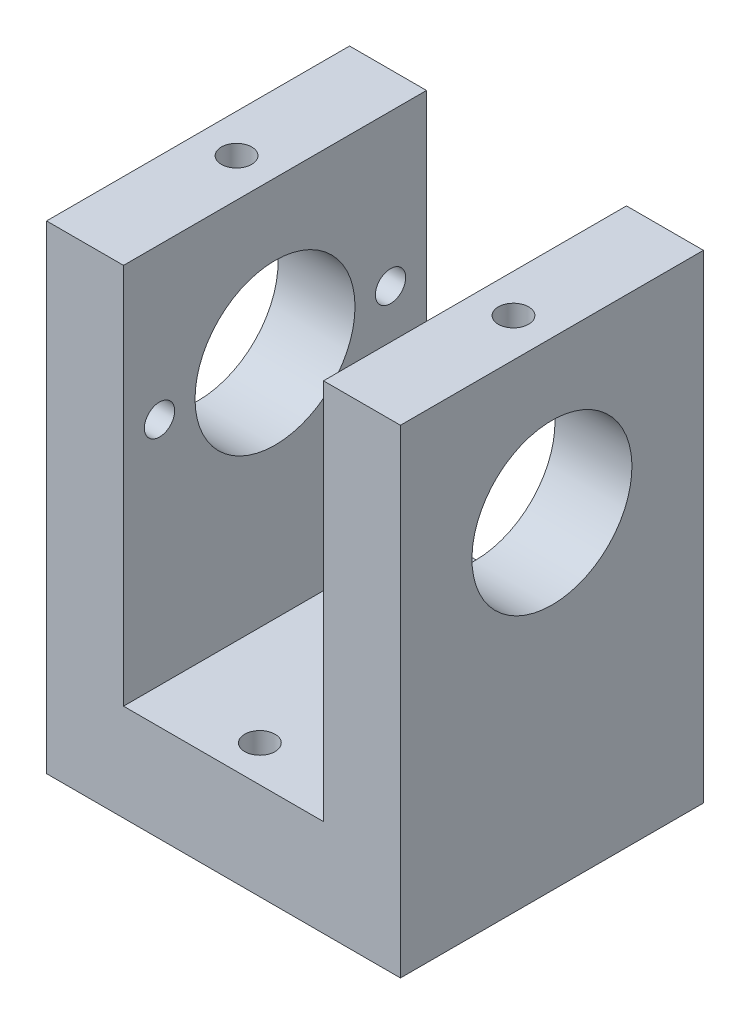
ISO-10303-21;
HEADER;
FILE_DESCRIPTION(('STEP AP214'),'2;1');
FILE_NAME('part.step','',(''),(''),'','','');
FILE_SCHEMA(('AUTOMOTIVE_DESIGN { 1 0 10303 214 1 1 1 1 }'));
ENDSEC;
DATA;
#1=APPLICATION_CONTEXT('core data for automotive mechanical design processes');
#2=APPLICATION_PROTOCOL_DEFINITION('international standard','automotive_design',2000,#1);
#3=PRODUCT_CONTEXT('',#1,'mechanical');
#4=PRODUCT('Part','Part','',(#3));
#5=PRODUCT_RELATED_PRODUCT_CATEGORY('part','',(#4));
#6=PRODUCT_DEFINITION_FORMATION('','',#4);
#7=PRODUCT_DEFINITION_CONTEXT('part definition',#1,'design');
#8=PRODUCT_DEFINITION('design','',#6,#7);
#9=PRODUCT_DEFINITION_SHAPE('','',#8);
#10=(LENGTH_UNIT() NAMED_UNIT(*) SI_UNIT(.MILLI.,.METRE.));
#11=(NAMED_UNIT(*) PLANE_ANGLE_UNIT() SI_UNIT($,.RADIAN.));
#12=(NAMED_UNIT(*) SI_UNIT($,.STERADIAN.) SOLID_ANGLE_UNIT());
#13=UNCERTAINTY_MEASURE_WITH_UNIT(LENGTH_MEASURE(1.E-05),#10,'distance_accuracy_value','');
#14=(GEOMETRIC_REPRESENTATION_CONTEXT(3) GLOBAL_UNCERTAINTY_ASSIGNED_CONTEXT((#13)) GLOBAL_UNIT_ASSIGNED_CONTEXT((#10,
#11,#12)) REPRESENTATION_CONTEXT('',''));
#15=CARTESIAN_POINT('',(0.,0.,0.));
#16=DIRECTION('',(0.,0.,1.));
#17=DIRECTION('',(1.,0.,0.));
#18=AXIS2_PLACEMENT_3D('',#15,#16,#17);
#19=CARTESIAN_POINT('',(-14.6,12.5,-12.5));
#20=DIRECTION('',(0.,1.,0.));
#21=DIRECTION('',(0.,0.,1.));
#22=AXIS2_PLACEMENT_3D('',#19,#20,#21);
#23=PLANE('',#22);
#24=CARTESIAN_POINT('',(-11.425,12.5,0.));
#25=DIRECTION('',(0.,1.,0.));
#26=DIRECTION('',(0.,0.,1.));
#27=AXIS2_PLACEMENT_3D('',#24,#25,#26);
#28=CIRCLE('',#27,1.24999999999999);
#29=CARTESIAN_POINT('',(-11.425,12.5,1.24999999999999));
#30=VERTEX_POINT('',#29);
#31=EDGE_CURVE('E129',#30,#30,#28,.T.);
#32=ORIENTED_EDGE('',*,*,#31,.F.);
#33=EDGE_LOOP('',(#32));
#34=FACE_BOUND('',#33,.T.);
#35=DIRECTION('',(0.,0.,1.));
#36=VECTOR('',#35,1.);
#37=CARTESIAN_POINT('',(-14.6,12.5,-12.5));
#38=LINE('',#37,#36);
#39=CARTESIAN_POINT('',(-14.6,12.5,-12.5));
#40=VERTEX_POINT('',#39);
#41=CARTESIAN_POINT('',(-14.6,12.5,12.5));
#42=VERTEX_POINT('',#41);
#43=EDGE_CURVE('E192',#40,#42,#38,.T.);
#44=ORIENTED_EDGE('',*,*,#43,.T.);
#45=DIRECTION('',(-1.,0.,0.));
#46=VECTOR('',#45,1.);
#47=CARTESIAN_POINT('',(-14.6,12.5,12.5));
#48=LINE('',#47,#46);
#49=CARTESIAN_POINT('',(-8.25,12.5,12.5));
#50=VERTEX_POINT('',#49);
#51=EDGE_CURVE('E148',#50,#42,#48,.T.);
#52=ORIENTED_EDGE('',*,*,#51,.F.);
#53=DIRECTION('',(0.,0.,1.));
#54=VECTOR('',#53,1.);
#55=CARTESIAN_POINT('',(-8.25,12.5,-12.5));
#56=LINE('',#55,#54);
#57=CARTESIAN_POINT('',(-8.25,12.5,-12.5));
#58=VERTEX_POINT('',#57);
#59=EDGE_CURVE('E11',#58,#50,#56,.T.);
#60=ORIENTED_EDGE('',*,*,#59,.F.);
#61=DIRECTION('',(-1.,0.,0.));
#62=VECTOR('',#61,1.);
#63=CARTESIAN_POINT('',(-14.6,12.5,-12.5));
#64=LINE('',#63,#62);
#65=EDGE_CURVE('E172',#58,#40,#64,.T.);
#66=ORIENTED_EDGE('',*,*,#65,.T.);
#67=EDGE_LOOP('',(#44,#52,#60,#66));
#68=FACE_BOUND('',#67,.T.);
#69=ADVANCED_FACE('F33',(#34,#68),#23,.T.);
#70=CARTESIAN_POINT('',(-8.25,12.5,-12.5));
#71=DIRECTION('',(1.,0.,0.));
#72=DIRECTION('',(0.,1.,0.));
#73=AXIS2_PLACEMENT_3D('',#70,#71,#72);
#74=PLANE('',#73);
#75=CARTESIAN_POINT('',(-8.25,0.,-9.53));
#76=DIRECTION('',(1.,0.,0.));
#77=DIRECTION('',(0.,1.,0.));
#78=AXIS2_PLACEMENT_3D('',#75,#76,#77);
#79=CIRCLE('',#78,1.24999999999999);
#80=CARTESIAN_POINT('',(-8.25,1.24999999999999,-9.53));
#81=VERTEX_POINT('',#80);
#82=EDGE_CURVE('E464',#81,#81,#79,.T.);
#83=ORIENTED_EDGE('',*,*,#82,.F.);
#84=EDGE_LOOP('',(#83));
#85=FACE_BOUND('',#84,.T.);
#86=CARTESIAN_POINT('',(-8.25,0.,9.53));
#87=DIRECTION('',(1.,0.,0.));
#88=DIRECTION('',(0.,1.,0.));
#89=AXIS2_PLACEMENT_3D('',#86,#87,#88);
#90=CIRCLE('',#89,1.24999999999999);
#91=CARTESIAN_POINT('',(-8.25,1.24999999999999,9.53));
#92=VERTEX_POINT('',#91);
#93=EDGE_CURVE('E123',#92,#92,#90,.T.);
#94=ORIENTED_EDGE('',*,*,#93,.F.);
#95=EDGE_LOOP('',(#94));
#96=FACE_BOUND('',#95,.T.);
#97=CARTESIAN_POINT('',(-8.25,0.,0.));
#98=DIRECTION('',(1.,0.,0.));
#99=DIRECTION('',(0.,1.,0.));
#100=AXIS2_PLACEMENT_3D('',#97,#98,#99);
#101=CIRCLE('',#100,6.6);
#102=CARTESIAN_POINT('',(-8.25,6.6,0.));
#103=VERTEX_POINT('',#102);
#104=EDGE_CURVE('E145',#103,#103,#101,.T.);
#105=ORIENTED_EDGE('',*,*,#104,.F.);
#106=EDGE_LOOP('',(#105));
#107=FACE_BOUND('',#106,.T.);
#108=ORIENTED_EDGE('',*,*,#59,.T.);
#109=DIRECTION('',(0.,1.,0.));
#110=VECTOR('',#109,1.);
#111=CARTESIAN_POINT('',(-8.25,12.5,12.5));
#112=LINE('',#111,#110);
#113=CARTESIAN_POINT('',(-8.25,-19.,12.5));
#114=VERTEX_POINT('',#113);
#115=EDGE_CURVE('E169',#114,#50,#112,.T.);
#116=ORIENTED_EDGE('',*,*,#115,.F.);
#117=DIRECTION('',(0.,0.,1.));
#118=VECTOR('',#117,1.);
#119=CARTESIAN_POINT('',(-8.25,-19.,-12.5));
#120=LINE('',#119,#118);
#121=CARTESIAN_POINT('',(-8.25,-19.,-12.5));
#122=VERTEX_POINT('',#121);
#123=EDGE_CURVE('E45',#122,#114,#120,.T.);
#124=ORIENTED_EDGE('',*,*,#123,.F.);
#125=DIRECTION('',(0.,1.,0.));
#126=VECTOR('',#125,1.);
#127=CARTESIAN_POINT('',(-8.25,12.5,-12.5));
#128=LINE('',#127,#126);
#129=EDGE_CURVE('E191',#122,#58,#128,.T.);
#130=ORIENTED_EDGE('',*,*,#129,.T.);
#131=EDGE_LOOP('',(#108,#116,#124,#130));
#132=FACE_BOUND('',#131,.T.);
#133=ADVANCED_FACE('F250',(#85,#96,#107,#132),#74,.T.);
#134=CARTESIAN_POINT('',(-8.25,-19.,-12.5));
#135=DIRECTION('',(0.,1.,0.));
#136=DIRECTION('',(-1.,0.,0.));
#137=AXIS2_PLACEMENT_3D('',#134,#135,#136);
#138=PLANE('',#137);
#139=CARTESIAN_POINT('',(0.,-19.,9.5));
#140=DIRECTION('',(0.,1.,0.));
#141=DIRECTION('',(-1.,0.,0.));
#142=AXIS2_PLACEMENT_3D('',#139,#140,#141);
#143=CIRCLE('',#142,1.24999999999999);
#144=CARTESIAN_POINT('',(-1.24999999999999,-19.,9.5));
#145=VERTEX_POINT('',#144);
#146=EDGE_CURVE('E477',#145,#145,#143,.T.);
#147=ORIENTED_EDGE('',*,*,#146,.F.);
#148=EDGE_LOOP('',(#147));
#149=FACE_BOUND('',#148,.T.);
#150=CARTESIAN_POINT('',(0.,-19.,-9.5));
#151=DIRECTION('',(0.,1.,0.));
#152=DIRECTION('',(-1.,0.,0.));
#153=AXIS2_PLACEMENT_3D('',#150,#151,#152);
#154=CIRCLE('',#153,1.24999999999999);
#155=CARTESIAN_POINT('',(-1.24999999999999,-19.,-9.5));
#156=VERTEX_POINT('',#155);
#157=EDGE_CURVE('E471',#156,#156,#154,.T.);
#158=ORIENTED_EDGE('',*,*,#157,.F.);
#159=EDGE_LOOP('',(#158));
#160=FACE_BOUND('',#159,.T.);
#161=ORIENTED_EDGE('',*,*,#123,.T.);
#162=DIRECTION('',(-1.,0.,0.));
#163=VECTOR('',#162,1.);
#164=CARTESIAN_POINT('',(-8.25,-19.,12.5));
#165=LINE('',#164,#163);
#166=CARTESIAN_POINT('',(8.25,-19.,12.5));
#167=VERTEX_POINT('',#166);
#168=EDGE_CURVE('E166',#167,#114,#165,.T.);
#169=ORIENTED_EDGE('',*,*,#168,.F.);
#170=DIRECTION('',(0.,0.,1.));
#171=VECTOR('',#170,1.);
#172=CARTESIAN_POINT('',(8.25,-19.,-12.5));
#173=LINE('',#172,#171);
#174=CARTESIAN_POINT('',(8.25,-19.,-12.5));
#175=VERTEX_POINT('',#174);
#176=EDGE_CURVE('E195',#175,#167,#173,.T.);
#177=ORIENTED_EDGE('',*,*,#176,.F.);
#178=DIRECTION('',(-1.,0.,0.));
#179=VECTOR('',#178,1.);
#180=CARTESIAN_POINT('',(-8.25,-19.,-12.5));
#181=LINE('',#180,#179);
#182=EDGE_CURVE('E189',#175,#122,#181,.T.);
#183=ORIENTED_EDGE('',*,*,#182,.T.);
#184=EDGE_LOOP('',(#161,#169,#177,#183));
#185=FACE_BOUND('',#184,.T.);
#186=ADVANCED_FACE('F255',(#149,#160,#185),#138,.T.);
#187=CARTESIAN_POINT('',(8.25,-19.,-12.5));
#188=DIRECTION('',(-1.,0.,0.));
#189=DIRECTION('',(0.,-1.,0.));
#190=AXIS2_PLACEMENT_3D('',#187,#188,#189);
#191=PLANE('',#190);
#192=CARTESIAN_POINT('',(8.25,0.,0.));
#193=DIRECTION('',(-1.,0.,0.));
#194=DIRECTION('',(0.,-1.,0.));
#195=AXIS2_PLACEMENT_3D('',#192,#193,#194);
#196=CIRCLE('',#195,6.6);
#197=CARTESIAN_POINT('',(8.25,-6.6,0.));
#198=VERTEX_POINT('',#197);
#199=EDGE_CURVE('E139',#198,#198,#196,.T.);
#200=ORIENTED_EDGE('',*,*,#199,.F.);
#201=EDGE_LOOP('',(#200));
#202=FACE_BOUND('',#201,.T.);
#203=ORIENTED_EDGE('',*,*,#176,.T.);
#204=DIRECTION('',(0.,-1.,0.));
#205=VECTOR('',#204,1.);
#206=CARTESIAN_POINT('',(8.25,-19.,12.5));
#207=LINE('',#206,#205);
#208=CARTESIAN_POINT('',(8.25,12.5,12.5));
#209=VERTEX_POINT('',#208);
#210=EDGE_CURVE('E163',#209,#167,#207,.T.);
#211=ORIENTED_EDGE('',*,*,#210,.F.);
#212=DIRECTION('',(0.,0.,1.));
#213=VECTOR('',#212,1.);
#214=CARTESIAN_POINT('',(8.25,12.5,-12.5));
#215=LINE('',#214,#213);
#216=CARTESIAN_POINT('',(8.25,12.5,-12.5));
#217=VERTEX_POINT('',#216);
#218=EDGE_CURVE('E197',#217,#209,#215,.T.);
#219=ORIENTED_EDGE('',*,*,#218,.F.);
#220=DIRECTION('',(0.,-1.,0.));
#221=VECTOR('',#220,1.);
#222=CARTESIAN_POINT('',(8.25,-19.,-12.5));
#223=LINE('',#222,#221);
#224=EDGE_CURVE('E186',#217,#175,#223,.T.);
#225=ORIENTED_EDGE('',*,*,#224,.T.);
#226=EDGE_LOOP('',(#203,#211,#219,#225));
#227=FACE_BOUND('',#226,.T.);
#228=ADVANCED_FACE('F284',(#202,#227),#191,.T.);
#229=CARTESIAN_POINT('',(8.25,12.5,-12.5));
#230=DIRECTION('',(0.,1.,0.));
#231=DIRECTION('',(-1.,0.,0.));
#232=AXIS2_PLACEMENT_3D('',#229,#230,#231);
#233=PLANE('',#232);
#234=CARTESIAN_POINT('',(11.425,12.5,0.));
#235=DIRECTION('',(0.,1.,0.));
#236=DIRECTION('',(0.,0.,1.));
#237=AXIS2_PLACEMENT_3D('',#234,#235,#236);
#238=CIRCLE('',#237,1.24999999999999);
#239=CARTESIAN_POINT('',(11.425,12.5,1.24999999999999));
#240=VERTEX_POINT('',#239);
#241=EDGE_CURVE('E132',#240,#240,#238,.T.);
#242=ORIENTED_EDGE('',*,*,#241,.F.);
#243=EDGE_LOOP('',(#242));
#244=FACE_BOUND('',#243,.T.);
#245=ORIENTED_EDGE('',*,*,#218,.T.);
#246=DIRECTION('',(-1.,0.,0.));
#247=VECTOR('',#246,1.);
#248=CARTESIAN_POINT('',(8.25,12.5,12.5));
#249=LINE('',#248,#247);
#250=CARTESIAN_POINT('',(14.6,12.5,12.5));
#251=VERTEX_POINT('',#250);
#252=EDGE_CURVE('E160',#251,#209,#249,.T.);
#253=ORIENTED_EDGE('',*,*,#252,.F.);
#254=DIRECTION('',(0.,0.,1.));
#255=VECTOR('',#254,1.);
#256=CARTESIAN_POINT('',(14.6,12.5,-12.5));
#257=LINE('',#256,#255);
#258=CARTESIAN_POINT('',(14.6,12.5,-12.5));
#259=VERTEX_POINT('',#258);
#260=EDGE_CURVE('E199',#259,#251,#257,.T.);
#261=ORIENTED_EDGE('',*,*,#260,.F.);
#262=DIRECTION('',(-1.,0.,0.));
#263=VECTOR('',#262,1.);
#264=CARTESIAN_POINT('',(8.25,12.5,-12.5));
#265=LINE('',#264,#263);
#266=EDGE_CURVE('E183',#259,#217,#265,.T.);
#267=ORIENTED_EDGE('',*,*,#266,.T.);
#268=EDGE_LOOP('',(#245,#253,#261,#267));
#269=FACE_BOUND('',#268,.T.);
#270=ADVANCED_FACE('F282',(#244,#269),#233,.T.);
#271=CARTESIAN_POINT('',(14.6,-27.,-12.5));
#272=DIRECTION('',(1.,0.,0.));
#273=DIRECTION('',(0.,1.,0.));
#274=AXIS2_PLACEMENT_3D('',#271,#272,#273);
#275=PLANE('',#274);
#276=CARTESIAN_POINT('',(14.6,0.,0.));
#277=DIRECTION('',(-1.,0.,0.));
#278=DIRECTION('',(0.,-1.,0.));
#279=AXIS2_PLACEMENT_3D('',#276,#277,#278);
#280=CIRCLE('',#279,6.6);
#281=CARTESIAN_POINT('',(14.6,-6.6,0.));
#282=VERTEX_POINT('',#281);
#283=EDGE_CURVE('E136',#282,#282,#280,.T.);
#284=ORIENTED_EDGE('',*,*,#283,.T.);
#285=EDGE_LOOP('',(#284));
#286=FACE_BOUND('',#285,.T.);
#287=ORIENTED_EDGE('',*,*,#260,.T.);
#288=DIRECTION('',(0.,1.,0.));
#289=VECTOR('',#288,1.);
#290=CARTESIAN_POINT('',(14.6,-27.,12.5));
#291=LINE('',#290,#289);
#292=CARTESIAN_POINT('',(14.6,-27.,12.5));
#293=VERTEX_POINT('',#292);
#294=EDGE_CURVE('E157',#293,#251,#291,.T.);
#295=ORIENTED_EDGE('',*,*,#294,.F.);
#296=DIRECTION('',(0.,0.,1.));
#297=VECTOR('',#296,1.);
#298=CARTESIAN_POINT('',(14.6,-27.,-12.5));
#299=LINE('',#298,#297);
#300=CARTESIAN_POINT('',(14.6,-27.,-12.5));
#301=VERTEX_POINT('',#300);
#302=EDGE_CURVE('E201',#301,#293,#299,.T.);
#303=ORIENTED_EDGE('',*,*,#302,.F.);
#304=DIRECTION('',(0.,1.,0.));
#305=VECTOR('',#304,1.);
#306=CARTESIAN_POINT('',(14.6,-27.,-12.5));
#307=LINE('',#306,#305);
#308=EDGE_CURVE('E180',#301,#259,#307,.T.);
#309=ORIENTED_EDGE('',*,*,#308,.T.);
#310=EDGE_LOOP('',(#287,#295,#303,#309));
#311=FACE_BOUND('',#310,.T.);
#312=ADVANCED_FACE('F280',(#286,#311),#275,.T.);
#313=CARTESIAN_POINT('',(-14.6,-27.,-12.5));
#314=DIRECTION('',(0.,-1.,0.));
#315=DIRECTION('',(1.,0.,0.));
#316=AXIS2_PLACEMENT_3D('',#313,#314,#315);
#317=PLANE('',#316);
#318=CARTESIAN_POINT('',(0.,-27.,9.5));
#319=DIRECTION('',(0.,-1.,0.));
#320=DIRECTION('',(0.,0.,-1.));
#321=AXIS2_PLACEMENT_3D('',#318,#319,#320);
#322=CIRCLE('',#321,1.24999999999999);
#323=CARTESIAN_POINT('',(0.,-27.,8.25000000000001));
#324=VERTEX_POINT('',#323);
#325=EDGE_CURVE('E480',#324,#324,#322,.T.);
#326=ORIENTED_EDGE('',*,*,#325,.F.);
#327=EDGE_LOOP('',(#326));
#328=FACE_BOUND('',#327,.T.);
#329=CARTESIAN_POINT('',(0.,-27.,-9.5));
#330=DIRECTION('',(0.,-1.,0.));
#331=DIRECTION('',(0.,0.,-1.));
#332=AXIS2_PLACEMENT_3D('',#329,#330,#331);
#333=CIRCLE('',#332,1.24999999999999);
#334=CARTESIAN_POINT('',(0.,-27.,-10.75));
#335=VERTEX_POINT('',#334);
#336=EDGE_CURVE('E474',#335,#335,#333,.T.);
#337=ORIENTED_EDGE('',*,*,#336,.F.);
#338=EDGE_LOOP('',(#337));
#339=FACE_BOUND('',#338,.T.);
#340=CARTESIAN_POINT('',(10.1,-27.,0.));
#341=DIRECTION('',(0.,-1.,0.));
#342=DIRECTION('',(0.,0.,-1.));
#343=AXIS2_PLACEMENT_3D('',#340,#341,#342);
#344=CIRCLE('',#343,1.65);
#345=CARTESIAN_POINT('',(10.1,-27.,-1.65));
#346=VERTEX_POINT('',#345);
#347=EDGE_CURVE('E117',#346,#346,#344,.T.);
#348=ORIENTED_EDGE('',*,*,#347,.F.);
#349=EDGE_LOOP('',(#348));
#350=FACE_BOUND('',#349,.T.);
#351=CARTESIAN_POINT('',(-10.1,-27.,0.));
#352=DIRECTION('',(0.,-1.,0.));
#353=DIRECTION('',(0.,0.,-1.));
#354=AXIS2_PLACEMENT_3D('',#351,#352,#353);
#355=CIRCLE('',#354,1.65);
#356=CARTESIAN_POINT('',(-10.1,-27.,-1.65));
#357=VERTEX_POINT('',#356);
#358=EDGE_CURVE('E116',#357,#357,#355,.T.);
#359=ORIENTED_EDGE('',*,*,#358,.F.);
#360=EDGE_LOOP('',(#359));
#361=FACE_BOUND('',#360,.T.);
#362=ORIENTED_EDGE('',*,*,#302,.T.);
#363=DIRECTION('',(1.,0.,0.));
#364=VECTOR('',#363,1.);
#365=CARTESIAN_POINT('',(-14.6,-27.,12.5));
#366=LINE('',#365,#364);
#367=CARTESIAN_POINT('',(-14.6,-27.,12.5));
#368=VERTEX_POINT('',#367);
#369=EDGE_CURVE('E154',#368,#293,#366,.T.);
#370=ORIENTED_EDGE('',*,*,#369,.F.);
#371=DIRECTION('',(0.,0.,1.));
#372=VECTOR('',#371,1.);
#373=CARTESIAN_POINT('',(-14.6,-27.,-12.5));
#374=LINE('',#373,#372);
#375=CARTESIAN_POINT('',(-14.6,-27.,-12.5));
#376=VERTEX_POINT('',#375);
#377=EDGE_CURVE('E203',#376,#368,#374,.T.);
#378=ORIENTED_EDGE('',*,*,#377,.F.);
#379=DIRECTION('',(1.,0.,0.));
#380=VECTOR('',#379,1.);
#381=CARTESIAN_POINT('',(-14.6,-27.,-12.5));
#382=LINE('',#381,#380);
#383=EDGE_CURVE('E177',#376,#301,#382,.T.);
#384=ORIENTED_EDGE('',*,*,#383,.T.);
#385=EDGE_LOOP('',(#362,#370,#378,#384));
#386=FACE_BOUND('',#385,.T.);
#387=ADVANCED_FACE('F276',(#328,#339,#350,#361,#386),#317,.T.);
#388=CARTESIAN_POINT('',(-14.6,12.5,-12.5));
#389=DIRECTION('',(-1.,0.,0.));
#390=DIRECTION('',(0.,-1.,0.));
#391=AXIS2_PLACEMENT_3D('',#388,#389,#390);
#392=PLANE('',#391);
#393=CARTESIAN_POINT('',(-14.6,0.,-9.53));
#394=DIRECTION('',(-1.,0.,0.));
#395=DIRECTION('',(0.,0.,1.));
#396=AXIS2_PLACEMENT_3D('',#393,#394,#395);
#397=CIRCLE('',#396,1.24999999999999);
#398=CARTESIAN_POINT('',(-14.6,0.,-8.28000000000001));
#399=VERTEX_POINT('',#398);
#400=EDGE_CURVE('E315',#399,#399,#397,.T.);
#401=ORIENTED_EDGE('',*,*,#400,.F.);
#402=EDGE_LOOP('',(#401));
#403=FACE_BOUND('',#402,.T.);
#404=CARTESIAN_POINT('',(-14.6,0.,9.53));
#405=DIRECTION('',(-1.,0.,0.));
#406=DIRECTION('',(0.,0.,1.));
#407=AXIS2_PLACEMENT_3D('',#404,#405,#406);
#408=CIRCLE('',#407,1.24999999999999);
#409=CARTESIAN_POINT('',(-14.6,0.,10.78));
#410=VERTEX_POINT('',#409);
#411=EDGE_CURVE('E319',#410,#410,#408,.T.);
#412=ORIENTED_EDGE('',*,*,#411,.F.);
#413=EDGE_LOOP('',(#412));
#414=FACE_BOUND('',#413,.T.);
#415=CARTESIAN_POINT('',(-14.6,0.,0.));
#416=DIRECTION('',(-1.,0.,0.));
#417=DIRECTION('',(0.,-1.,0.));
#418=AXIS2_PLACEMENT_3D('',#415,#416,#417);
#419=CIRCLE('',#418,6.6);
#420=CARTESIAN_POINT('',(-14.6,-6.6,0.));
#421=VERTEX_POINT('',#420);
#422=EDGE_CURVE('E140',#421,#421,#419,.T.);
#423=ORIENTED_EDGE('',*,*,#422,.F.);
#424=EDGE_LOOP('',(#423));
#425=FACE_BOUND('',#424,.T.);
#426=ORIENTED_EDGE('',*,*,#377,.T.);
#427=DIRECTION('',(0.,-1.,0.));
#428=VECTOR('',#427,1.);
#429=CARTESIAN_POINT('',(-14.6,12.5,12.5));
#430=LINE('',#429,#428);
#431=EDGE_CURVE('E151',#42,#368,#430,.T.);
#432=ORIENTED_EDGE('',*,*,#431,.F.);
#433=ORIENTED_EDGE('',*,*,#43,.F.);
#434=DIRECTION('',(0.,-1.,0.));
#435=VECTOR('',#434,1.);
#436=CARTESIAN_POINT('',(-14.6,12.5,-12.5));
#437=LINE('',#436,#435);
#438=EDGE_CURVE('E174',#40,#376,#437,.T.);
#439=ORIENTED_EDGE('',*,*,#438,.T.);
#440=EDGE_LOOP('',(#426,#432,#433,#439));
#441=FACE_BOUND('',#440,.T.);
#442=ADVANCED_FACE('F262',(#403,#414,#425,#441),#392,.T.);
#443=CARTESIAN_POINT('',(0.,0.,-12.5));
#444=DIRECTION('',(0.,0.,-1.));
#445=DIRECTION('',(-1.,0.,0.));
#446=AXIS2_PLACEMENT_3D('',#443,#444,#445);
#447=PLANE('',#446);
#448=ORIENTED_EDGE('',*,*,#65,.F.);
#449=ORIENTED_EDGE('',*,*,#129,.F.);
#450=ORIENTED_EDGE('',*,*,#182,.F.);
#451=ORIENTED_EDGE('',*,*,#224,.F.);
#452=ORIENTED_EDGE('',*,*,#266,.F.);
#453=ORIENTED_EDGE('',*,*,#308,.F.);
#454=ORIENTED_EDGE('',*,*,#383,.F.);
#455=ORIENTED_EDGE('',*,*,#438,.F.);
#456=EDGE_LOOP('',(#448,#449,#450,#451,#452,#453,#454,#455));
#457=FACE_BOUND('',#456,.T.);
#458=ADVANCED_FACE('F270',(#457),#447,.T.);
#459=CARTESIAN_POINT('',(0.,0.,12.5));
#460=DIRECTION('',(0.,0.,-1.));
#461=DIRECTION('',(-1.,0.,0.));
#462=AXIS2_PLACEMENT_3D('',#459,#460,#461);
#463=PLANE('',#462);
#464=ORIENTED_EDGE('',*,*,#51,.T.);
#465=ORIENTED_EDGE('',*,*,#431,.T.);
#466=ORIENTED_EDGE('',*,*,#369,.T.);
#467=ORIENTED_EDGE('',*,*,#294,.T.);
#468=ORIENTED_EDGE('',*,*,#252,.T.);
#469=ORIENTED_EDGE('',*,*,#210,.T.);
#470=ORIENTED_EDGE('',*,*,#168,.T.);
#471=ORIENTED_EDGE('',*,*,#115,.T.);
#472=EDGE_LOOP('',(#464,#465,#466,#467,#468,#469,#470,#471));
#473=FACE_BOUND('',#472,.T.);
#474=ADVANCED_FACE('F265',(#473),#463,.F.);
#475=CARTESIAN_POINT('',(14.6,0.,0.));
#476=DIRECTION('',(-1.,0.,0.));
#477=DIRECTION('',(0.,-1.,0.));
#478=AXIS2_PLACEMENT_3D('',#475,#476,#477);
#479=CYLINDRICAL_SURFACE('',#478,6.6);
#480=CARTESIAN_POINT('',(-11.425,6.4805478163501,1.24999999999999));
#481=CARTESIAN_POINT('',(-11.3554659062431,6.48054916879987,1.24999734645734));
#482=CARTESIAN_POINT('',(-11.285897536388,6.48167908829111,1.24417832383001));
#483=CARTESIAN_POINT('',(-11.1487234000047,6.48607090142095,1.22107222009981));
#484=CARTESIAN_POINT('',(-11.0811193343764,6.48933458842466,1.20377549216011));
#485=CARTESIAN_POINT('',(-10.9498784113343,6.49761134560175,1.15826500570324));
#486=CARTESIAN_POINT('',(-10.8862378867205,6.50262276949558,1.13006151808871));
#487=CARTESIAN_POINT('',(-10.7645954296643,6.51382838804716,1.06356544763095));
#488=CARTESIAN_POINT('',(-10.7065930762568,6.5200224942993,1.02527361881104));
#489=CARTESIAN_POINT('',(-10.597132942583,6.53298339460089,0.939169658007659));
#490=CARTESIAN_POINT('',(-10.5457571377269,6.5397559029383,0.891254158662136));
#491=CARTESIAN_POINT('',(-10.451722912823,6.55306007242744,0.787486392150386));
#492=CARTESIAN_POINT('',(-10.4090650706917,6.55959171758876,0.731633599234246));
#493=CARTESIAN_POINT('',(-10.3333629568065,6.57173949679174,0.613037611531206));
#494=CARTESIAN_POINT('',(-10.3003960654167,6.57734811233422,0.550244187299977));
#495=CARTESIAN_POINT('',(-10.2455103156274,6.58695389752338,0.419886007711528));
#496=CARTESIAN_POINT('',(-10.2235905304134,6.59095120234788,0.352321653161413));
#497=CARTESIAN_POINT('',(-10.1916749545398,6.59684361596882,0.215189180324019));
#498=CARTESIAN_POINT('',(-10.1815409370933,6.59876307544167,0.145654295925611));
#499=CARTESIAN_POINT('',(-10.1730537865286,6.60036748280356,0.00584655150124055));
#500=CARTESIAN_POINT('',(-10.174699630734,6.60005262466634,-0.0644262439335972));
#501=CARTESIAN_POINT('',(-10.1896196464267,6.59724287843016,-0.2027667992979));
#502=CARTESIAN_POINT('',(-10.2027449735005,6.59477589608557,-0.270851260831315));
#503=CARTESIAN_POINT('',(-10.2400158651315,6.58797041797057,-0.403833569308623));
#504=CARTESIAN_POINT('',(-10.2641618372985,6.5836318529781,-0.468731298289651));
#505=CARTESIAN_POINT('',(-10.3229298436442,6.57352414960613,-0.593928619517165));
#506=CARTESIAN_POINT('',(-10.3576112026502,6.56774694433467,-0.654199686634658));
#507=CARTESIAN_POINT('',(-10.4364217663079,6.55540056054607,-0.768122206428987));
#508=CARTESIAN_POINT('',(-10.4805519505078,6.5488312999484,-0.821772971877535));
#509=CARTESIAN_POINT('',(-10.5778271437826,6.53550685981067,-0.921814045300698));
#510=CARTESIAN_POINT('',(-10.6311023788678,6.5287503794765,-0.968077642487907));
#511=CARTESIAN_POINT('',(-10.7447220476927,6.51591111955931,-1.05103265134806));
#512=CARTESIAN_POINT('',(-10.8050665890538,6.50982835023544,-1.08772391726682));
#513=CARTESIAN_POINT('',(-10.9312819752822,6.49902323353184,-1.15052997640684));
#514=CARTESIAN_POINT('',(-10.9971623575099,6.49430329881387,-1.176626045432));
#515=CARTESIAN_POINT('',(-11.132482152161,6.48679496144541,-1.21734303704606));
#516=CARTESIAN_POINT('',(-11.2019211514724,6.48400633513664,-1.23196528840503));
#517=CARTESIAN_POINT('',(-11.3412435917531,6.48072068444216,-1.24913392300993));
#518=CARTESIAN_POINT('',(-11.4111037906276,6.48018909094801,-1.25186248946391));
#519=CARTESIAN_POINT('',(-11.5502815084642,6.48138514598406,-1.24565494094378));
#520=CARTESIAN_POINT('',(-11.619599054662,6.48311268038711,-1.23671941521897));
#521=CARTESIAN_POINT('',(-11.7551228754856,6.48860011506475,-1.20759382713752));
#522=CARTESIAN_POINT('',(-11.8213504975838,6.49234271140386,-1.18749954287941));
#523=CARTESIAN_POINT('',(-11.949498906905,6.50142362599991,-1.13672858155052));
#524=CARTESIAN_POINT('',(-12.0114193706885,6.50676206393502,-1.10605111078026));
#525=CARTESIAN_POINT('',(-12.1299975702232,6.51851171906722,-1.03456631005794));
#526=CARTESIAN_POINT('',(-12.1865848229092,6.52493481807464,-0.99364405367297));
#527=CARTESIAN_POINT('',(-12.2921552870619,6.53809677290019,-0.902986024735588));
#528=CARTESIAN_POINT('',(-12.3411377995313,6.54483565767006,-0.853249442904185));
#529=CARTESIAN_POINT('',(-12.4307904739498,6.55798113078423,-0.745560299671606));
#530=CARTESIAN_POINT('',(-12.4713380128809,6.56438192591678,-0.687504833819386));
#531=CARTESIAN_POINT('',(-12.5421036814297,6.57603206933037,-0.565300033417299));
#532=CARTESIAN_POINT('',(-12.5723222143319,6.58128146256374,-0.50115093691145));
#533=CARTESIAN_POINT('',(-12.621389226041,6.59001245015354,-0.368916205193942));
#534=CARTESIAN_POINT('',(-12.640297547131,6.59350333299056,-0.300853415284399));
#535=CARTESIAN_POINT('',(-12.6663981814833,6.59836362752461,-0.162445729181372));
#536=CARTESIAN_POINT('',(-12.6735917537038,6.59973326718618,-0.0921010790431824));
#537=CARTESIAN_POINT('',(-12.6760141307416,6.60019209450889,0.0476982421174214));
#538=CARTESIAN_POINT('',(-12.6714280129087,6.59931655775763,0.117149657985274));
#539=CARTESIAN_POINT('',(-12.6508270295616,6.59545683912902,0.254273288240613));
#540=CARTESIAN_POINT('',(-12.6348122784422,6.59247267835794,0.321945520429804));
#541=CARTESIAN_POINT('',(-12.5918872584582,6.58473114776625,0.453489405797066));
#542=CARTESIAN_POINT('',(-12.5649970664622,6.57997704666478,0.51736781479023));
#543=CARTESIAN_POINT('',(-12.5011068375392,6.56920986794539,0.639733514739726));
#544=CARTESIAN_POINT('',(-12.4641061049385,6.56319670370205,0.698220434354539));
#545=CARTESIAN_POINT('',(-12.3804099326445,6.55046388348935,0.809064139551332));
#546=CARTESIAN_POINT('',(-12.3335809722288,6.54373520282337,0.861319080847285));
#547=CARTESIAN_POINT('',(-12.2318343164629,6.53038616786458,0.957293133859461));
#548=CARTESIAN_POINT('',(-12.1769147196624,6.52376583944406,1.00101023339137));
#549=CARTESIAN_POINT('',(-12.0599231304754,6.51131448231033,1.07905736963359));
#550=CARTESIAN_POINT('',(-11.9977883171239,6.50549152393053,1.1132945685135));
#551=CARTESIAN_POINT('',(-11.8685579432235,6.49539151263701,1.17078955711854));
#552=CARTESIAN_POINT('',(-11.8014671072246,6.49111300973873,1.19405765130609));
#553=CARTESIAN_POINT('',(-11.6826540619283,6.4854728622442,1.22425695528426));
#554=CARTESIAN_POINT('',(-11.631624903935,6.48363700813798,1.23389394540034));
#555=CARTESIAN_POINT('',(-11.5287368414098,6.48117399772872,1.24676636730595));
#556=CARTESIAN_POINT('',(-11.4768779603357,6.48054680731508,1.2500019797537));
#557=CARTESIAN_POINT('',(-11.425,6.4805478163501,1.24999999999999));
#558=B_SPLINE_CURVE_WITH_KNOTS('',3,(#480,#481,#482,#483,#484,#485,#486,#487,#488,#489,#490,
#491,#492,#493,#494,#495,#496,#497,#498,#499,#500,#501,#502,#503,#504,#505,#506,#507,#508,#509,
#510,#511,#512,#513,#514,#515,#516,#517,#518,#519,#520,#521,#522,#523,#524,#525,#526,#527,#528,
#529,#530,#531,#532,#533,#534,#535,#536,#537,#538,#539,#540,#541,#542,#543,#544,#545,#546,#547,
#548,#549,#550,#551,#552,#553,#554,#555,#556,#557),.UNSPECIFIED.,.T.,.F.,(4,2,2,2,2,2,2,2,2,2,2,
2,2,2,2,2,2,2,2,2,2,2,2,2,2,2,2,2,2,2,2,2,2,2,2,2,2,2,4),(0.,0.208412418220932,
0.417000226154086,0.625392083266739,0.833768369160992,1.04451562235667,1.25527684152673,
1.46767788091792,1.68006109762293,1.88992747111442,2.09977562514157,2.30694253871489,
2.51411711518681,2.72248062556109,2.93086574719422,3.14251079869161,3.3541590726384,
3.56617976746569,3.77817590478673,3.98691308837003,4.19563972732838,4.40260190798594,
4.60957961340969,4.81899229864768,5.02842422088472,5.24071560266894,5.4529986948257,
5.66414842790026,5.87527546768148,6.08310573171374,6.29093391549868,6.49838017169047,
6.70584070518779,6.91632691325432,7.12686266865357,7.33939264606409,7.55172257133756,
7.70721918787265,7.86271141595482),.UNSPECIFIED.);
#559=CARTESIAN_POINT('',(-11.425,6.4805478163501,1.24999999999999));
#560=VERTEX_POINT('',#559);
#561=EDGE_CURVE('E36',#560,#560,#558,.T.);
#562=ORIENTED_EDGE('',*,*,#561,.T.);
#563=EDGE_LOOP('',(#562));
#564=FACE_BOUND('',#563,.T.);
#565=ORIENTED_EDGE('',*,*,#104,.T.);
#566=EDGE_LOOP('',(#565));
#567=FACE_BOUND('',#566,.T.);
#568=ORIENTED_EDGE('',*,*,#422,.T.);
#569=EDGE_LOOP('',(#568));
#570=FACE_BOUND('',#569,.T.);
#571=ADVANCED_FACE('F322',(#564,#567,#570),#479,.F.);
#572=CARTESIAN_POINT('',(11.425,6.4805478163501,1.24999999999999));
#573=CARTESIAN_POINT('',(11.4945340937569,6.48054916879988,1.24999734645734));
#574=CARTESIAN_POINT('',(11.564102463612,6.48167908829111,1.24417832383001));
#575=CARTESIAN_POINT('',(11.7012765999953,6.48607090142096,1.22107222009981));
#576=CARTESIAN_POINT('',(11.7688806656236,6.48933458842466,1.20377549216011));
#577=CARTESIAN_POINT('',(11.9001215886658,6.49761134560175,1.15826500570323));
#578=CARTESIAN_POINT('',(11.9637621132795,6.50262276949558,1.13006151808871));
#579=CARTESIAN_POINT('',(12.0854045703357,6.51382838804717,1.06356544763095));
#580=CARTESIAN_POINT('',(12.1434069237432,6.5200224942993,1.02527361881104));
#581=CARTESIAN_POINT('',(12.252867057417,6.53298339460089,0.939169658007659));
#582=CARTESIAN_POINT('',(12.3042428622731,6.5397559029383,0.891254158662137));
#583=CARTESIAN_POINT('',(12.398277087177,6.55306007242744,0.787486392150386));
#584=CARTESIAN_POINT('',(12.4409349293083,6.55959171758876,0.731633599234246));
#585=CARTESIAN_POINT('',(12.5166370431935,6.57173949679174,0.613037611531206));
#586=CARTESIAN_POINT('',(12.5496039345833,6.57734811233422,0.550244187299977));
#587=CARTESIAN_POINT('',(12.6044896843726,6.58695389752338,0.419886007711528));
#588=CARTESIAN_POINT('',(12.6264094695866,6.59095120234788,0.352321653161413));
#589=CARTESIAN_POINT('',(12.6583250454603,6.59684361596882,0.215189180324019));
#590=CARTESIAN_POINT('',(12.6684590629067,6.59876307544168,0.145654295925611));
#591=CARTESIAN_POINT('',(12.6769462134714,6.60036748280356,0.00584655150124055));
#592=CARTESIAN_POINT('',(12.675300369266,6.60005262466634,-0.0644262439335972));
#593=CARTESIAN_POINT('',(12.6603803535733,6.59724287843016,-0.2027667992979));
#594=CARTESIAN_POINT('',(12.6472550264995,6.59477589608557,-0.270851260831315));
#595=CARTESIAN_POINT('',(12.6099841348685,6.58797041797057,-0.403833569308623));
#596=CARTESIAN_POINT('',(12.5858381627015,6.58363185297811,-0.468731298289651));
#597=CARTESIAN_POINT('',(12.5270701563558,6.57352414960614,-0.593928619517166));
#598=CARTESIAN_POINT('',(12.4923887973498,6.56774694433467,-0.65419968663466));
#599=CARTESIAN_POINT('',(12.4135782336921,6.55540056054607,-0.768122206428989));
#600=CARTESIAN_POINT('',(12.3694480494922,6.54883129994841,-0.821772971877535));
#601=CARTESIAN_POINT('',(12.2721728562174,6.53550685981067,-0.921814045300698));
#602=CARTESIAN_POINT('',(12.2188976211322,6.52875037947651,-0.968077642487907));
#603=CARTESIAN_POINT('',(12.1052779523073,6.51591111955932,-1.05103265134806));
#604=CARTESIAN_POINT('',(12.0449334109462,6.50982835023545,-1.08772391726682));
#605=CARTESIAN_POINT('',(11.9187180247178,6.49902323353184,-1.15052997640684));
#606=CARTESIAN_POINT('',(11.8528376424901,6.49430329881387,-1.176626045432));
#607=CARTESIAN_POINT('',(11.717517847839,6.48679496144541,-1.21734303704606));
#608=CARTESIAN_POINT('',(11.6480788485276,6.48400633513664,-1.23196528840503));
#609=CARTESIAN_POINT('',(11.5087564082469,6.48072068444216,-1.24913392300993));
#610=CARTESIAN_POINT('',(11.4388962093724,6.48018909094802,-1.25186248946391));
#611=CARTESIAN_POINT('',(11.2997184915358,6.48138514598406,-1.24565494094378));
#612=CARTESIAN_POINT('',(11.230400945338,6.48311268038712,-1.23671941521897));
#613=CARTESIAN_POINT('',(11.0948771245144,6.48860011506476,-1.20759382713752));
#614=CARTESIAN_POINT('',(11.0286495024162,6.49234271140386,-1.18749954287941));
#615=CARTESIAN_POINT('',(10.900501093095,6.50142362599991,-1.13672858155052));
#616=CARTESIAN_POINT('',(10.8385806293115,6.50676206393502,-1.10605111078026));
#617=CARTESIAN_POINT('',(10.7200024297768,6.51851171906722,-1.03456631005794));
#618=CARTESIAN_POINT('',(10.6634151770908,6.52493481807465,-0.99364405367297));
#619=CARTESIAN_POINT('',(10.5578447129381,6.5380967729002,-0.902986024735588));
#620=CARTESIAN_POINT('',(10.5088622004687,6.54483565767007,-0.853249442904185));
#621=CARTESIAN_POINT('',(10.4192095260502,6.55798113078423,-0.745560299671607));
#622=CARTESIAN_POINT('',(10.3786619871191,6.56438192591678,-0.687504833819387));
#623=CARTESIAN_POINT('',(10.3078963185703,6.57603206933037,-0.565300033417299));
#624=CARTESIAN_POINT('',(10.2776777856681,6.58128146256374,-0.50115093691145));
#625=CARTESIAN_POINT('',(10.228610773959,6.59001245015354,-0.368916205193942));
#626=CARTESIAN_POINT('',(10.209702452869,6.59350333299057,-0.300853415284399));
#627=CARTESIAN_POINT('',(10.1836018185167,6.59836362752461,-0.162445729181372));
#628=CARTESIAN_POINT('',(10.1764082462962,6.59973326718618,-0.0921010790431823));
#629=CARTESIAN_POINT('',(10.1739858692584,6.6001920945089,0.0476982421174216));
#630=CARTESIAN_POINT('',(10.1785719870913,6.59931655775764,0.117149657985274));
#631=CARTESIAN_POINT('',(10.1991729704384,6.59545683912902,0.254273288240613));
#632=CARTESIAN_POINT('',(10.2151877215578,6.59247267835794,0.321945520429804));
#633=CARTESIAN_POINT('',(10.2581127415418,6.58473114776625,0.453489405797066));
#634=CARTESIAN_POINT('',(10.2850029335378,6.57997704666478,0.51736781479023));
#635=CARTESIAN_POINT('',(10.3488931624608,6.56920986794539,0.639733514739726));
#636=CARTESIAN_POINT('',(10.3858938950615,6.56319670370205,0.698220434354539));
#637=CARTESIAN_POINT('',(10.4695900673555,6.55046388348936,0.809064139551333));
#638=CARTESIAN_POINT('',(10.5164190277712,6.54373520282337,0.861319080847287));
#639=CARTESIAN_POINT('',(10.6181656835371,6.53038616786458,0.957293133859464));
#640=CARTESIAN_POINT('',(10.6730852803376,6.52376583944406,1.00101023339137));
#641=CARTESIAN_POINT('',(10.7900768695246,6.51131448231033,1.07905736963359));
#642=CARTESIAN_POINT('',(10.8522116828762,6.50549152393053,1.1132945685135));
#643=CARTESIAN_POINT('',(10.9814420567765,6.49539151263702,1.17078955711854));
#644=CARTESIAN_POINT('',(11.0485328927754,6.49111300973873,1.19405765130609));
#645=CARTESIAN_POINT('',(11.1673459380717,6.48547286224421,1.22425695528426));
#646=CARTESIAN_POINT('',(11.218375096065,6.48363700813798,1.23389394540034));
#647=CARTESIAN_POINT('',(11.3212631585902,6.48117399772873,1.24676636730595));
#648=CARTESIAN_POINT('',(11.3731220396643,6.48054680731508,1.2500019797537));
#649=CARTESIAN_POINT('',(11.425,6.4805478163501,1.24999999999999));
#650=B_SPLINE_CURVE_WITH_KNOTS('',3,(#572,#573,#574,#575,#576,#577,#578,#579,#580,#581,#582,
#583,#584,#585,#586,#587,#588,#589,#590,#591,#592,#593,#594,#595,#596,#597,#598,#599,#600,#601,
#602,#603,#604,#605,#606,#607,#608,#609,#610,#611,#612,#613,#614,#615,#616,#617,#618,#619,#620,
#621,#622,#623,#624,#625,#626,#627,#628,#629,#630,#631,#632,#633,#634,#635,#636,#637,#638,#639,
#640,#641,#642,#643,#644,#645,#646,#647,#648,#649),.UNSPECIFIED.,.T.,.F.,(4,2,2,2,2,2,2,2,2,2,2,
2,2,2,2,2,2,2,2,2,2,2,2,2,2,2,2,2,2,2,2,2,2,2,2,2,2,2,4),(0.,0.208412418220932,
0.417000226154086,0.625392083266739,0.833768369160992,1.04451562235667,1.25527684152673,
1.46767788091792,1.68006109762293,1.88992747111442,2.09977562514157,2.30694253871489,
2.51411711518681,2.72248062556109,2.93086574719422,3.14251079869161,3.3541590726384,
3.56617976746569,3.77817590478673,3.98691308837003,4.19563972732838,4.40260190798594,
4.60957961340969,4.81899229864768,5.02842422088472,5.24071560266894,5.4529986948257,
5.66414842790026,5.87527546768148,6.08310573171374,6.29093391549868,6.49838017169047,
6.70584070518779,6.91632691325433,7.12686266865358,7.33939264606409,7.55172257133756,
7.70721918787265,7.86271141595482),.UNSPECIFIED.);
#651=CARTESIAN_POINT('',(11.425,6.4805478163501,1.24999999999999));
#652=VERTEX_POINT('',#651);
#653=EDGE_CURVE('E135',#652,#652,#650,.T.);
#654=ORIENTED_EDGE('',*,*,#653,.T.);
#655=EDGE_LOOP('',(#654));
#656=FACE_BOUND('',#655,.T.);
#657=ORIENTED_EDGE('',*,*,#199,.T.);
#658=EDGE_LOOP('',(#657));
#659=FACE_BOUND('',#658,.T.);
#660=ORIENTED_EDGE('',*,*,#283,.F.);
#661=EDGE_LOOP('',(#660));
#662=FACE_BOUND('',#661,.T.);
#663=ADVANCED_FACE('F209',(#656,#659,#662),#479,.F.);
#664=CARTESIAN_POINT('',(11.425,12.5,0.));
#665=DIRECTION('',(0.,1.,0.));
#666=DIRECTION('',(0.,0.,1.));
#667=AXIS2_PLACEMENT_3D('',#664,#665,#666);
#668=CYLINDRICAL_SURFACE('',#667,1.24999999999999);
#669=ORIENTED_EDGE('',*,*,#241,.T.);
#670=EDGE_LOOP('',(#669));
#671=FACE_BOUND('',#670,.T.);
#672=ORIENTED_EDGE('',*,*,#653,.F.);
#673=EDGE_LOOP('',(#672));
#674=FACE_BOUND('',#673,.T.);
#675=ADVANCED_FACE('F212',(#671,#674),#668,.F.);
#676=CARTESIAN_POINT('',(-11.425,12.5,0.));
#677=DIRECTION('',(0.,1.,0.));
#678=DIRECTION('',(0.,0.,1.));
#679=AXIS2_PLACEMENT_3D('',#676,#677,#678);
#680=CYLINDRICAL_SURFACE('',#679,1.24999999999999);
#681=ORIENTED_EDGE('',*,*,#31,.T.);
#682=EDGE_LOOP('',(#681));
#683=FACE_BOUND('',#682,.T.);
#684=ORIENTED_EDGE('',*,*,#561,.F.);
#685=EDGE_LOOP('',(#684));
#686=FACE_BOUND('',#685,.T.);
#687=ADVANCED_FACE('F215',(#683,#686),#680,.F.);
#688=CARTESIAN_POINT('',(-10.1,-19.,0.));
#689=DIRECTION('',(0.,-1.,0.));
#690=DIRECTION('',(0.,0.,-1.));
#691=AXIS2_PLACEMENT_3D('',#688,#689,#690);
#692=CONICAL_SURFACE('',#691,1.65,1.02974425867665);
#693=CARTESIAN_POINT('',(-10.1,-18.0085799786045,0.));
#694=VERTEX_POINT('',#693);
#695=VERTEX_LOOP('',#694);
#696=FACE_BOUND('',#695,.T.);
#697=CARTESIAN_POINT('',(-10.1,-19.,0.));
#698=DIRECTION('',(0.,-1.,0.));
#699=DIRECTION('',(0.,0.,-1.));
#700=AXIS2_PLACEMENT_3D('',#697,#698,#699);
#701=CIRCLE('',#700,1.65);
#702=CARTESIAN_POINT('',(-10.1,-19.,-1.65));
#703=VERTEX_POINT('',#702);
#704=EDGE_CURVE('E120',#703,#703,#701,.T.);
#705=ORIENTED_EDGE('',*,*,#704,.T.);
#706=EDGE_LOOP('',(#705));
#707=FACE_BOUND('',#706,.T.);
#708=ADVANCED_FACE('F220',(#696,#707),#692,.F.);
#709=CARTESIAN_POINT('',(-10.1,-27.,0.));
#710=DIRECTION('',(0.,-1.,0.));
#711=DIRECTION('',(0.,0.,-1.));
#712=AXIS2_PLACEMENT_3D('',#709,#710,#711);
#713=CYLINDRICAL_SURFACE('',#712,1.65);
#714=ORIENTED_EDGE('',*,*,#704,.F.);
#715=EDGE_LOOP('',(#714));
#716=FACE_BOUND('',#715,.T.);
#717=ORIENTED_EDGE('',*,*,#358,.T.);
#718=EDGE_LOOP('',(#717));
#719=FACE_BOUND('',#718,.T.);
#720=ADVANCED_FACE('F110',(#716,#719),#713,.F.);
#721=CARTESIAN_POINT('',(10.1,-19.,0.));
#722=DIRECTION('',(0.,-1.,0.));
#723=DIRECTION('',(0.,0.,-1.));
#724=AXIS2_PLACEMENT_3D('',#721,#722,#723);
#725=CONICAL_SURFACE('',#724,1.65,1.02974425867665);
#726=CARTESIAN_POINT('',(10.1,-18.0085799786045,0.));
#727=VERTEX_POINT('',#726);
#728=VERTEX_LOOP('',#727);
#729=FACE_BOUND('',#728,.T.);
#730=CARTESIAN_POINT('',(10.1,-19.,0.));
#731=DIRECTION('',(0.,-1.,0.));
#732=DIRECTION('',(0.,0.,-1.));
#733=AXIS2_PLACEMENT_3D('',#730,#731,#732);
#734=CIRCLE('',#733,1.65);
#735=CARTESIAN_POINT('',(10.1,-19.,-1.65));
#736=VERTEX_POINT('',#735);
#737=EDGE_CURVE('E114',#736,#736,#734,.T.);
#738=ORIENTED_EDGE('',*,*,#737,.T.);
#739=EDGE_LOOP('',(#738));
#740=FACE_BOUND('',#739,.T.);
#741=ADVANCED_FACE('F106',(#729,#740),#725,.F.);
#742=CARTESIAN_POINT('',(10.1,-27.,0.));
#743=DIRECTION('',(0.,-1.,0.));
#744=DIRECTION('',(0.,0.,-1.));
#745=AXIS2_PLACEMENT_3D('',#742,#743,#744);
#746=CYLINDRICAL_SURFACE('',#745,1.65);
#747=ORIENTED_EDGE('',*,*,#737,.F.);
#748=EDGE_LOOP('',(#747));
#749=FACE_BOUND('',#748,.T.);
#750=ORIENTED_EDGE('',*,*,#347,.T.);
#751=EDGE_LOOP('',(#750));
#752=FACE_BOUND('',#751,.T.);
#753=ADVANCED_FACE('F109',(#749,#752),#746,.F.);
#754=CARTESIAN_POINT('',(-14.6,0.,9.53));
#755=DIRECTION('',(-1.,0.,0.));
#756=DIRECTION('',(0.,0.,1.));
#757=AXIS2_PLACEMENT_3D('',#754,#755,#756);
#758=CYLINDRICAL_SURFACE('',#757,1.24999999999999);
#759=ORIENTED_EDGE('',*,*,#411,.T.);
#760=EDGE_LOOP('',(#759));
#761=FACE_BOUND('',#760,.T.);
#762=ORIENTED_EDGE('',*,*,#93,.T.);
#763=EDGE_LOOP('',(#762));
#764=FACE_BOUND('',#763,.T.);
#765=ADVANCED_FACE('F230',(#761,#764),#758,.F.);
#766=CARTESIAN_POINT('',(-14.6,0.,-9.53));
#767=DIRECTION('',(-1.,0.,0.));
#768=DIRECTION('',(0.,0.,1.));
#769=AXIS2_PLACEMENT_3D('',#766,#767,#768);
#770=CYLINDRICAL_SURFACE('',#769,1.24999999999999);
#771=ORIENTED_EDGE('',*,*,#400,.T.);
#772=EDGE_LOOP('',(#771));
#773=FACE_BOUND('',#772,.T.);
#774=ORIENTED_EDGE('',*,*,#82,.T.);
#775=EDGE_LOOP('',(#774));
#776=FACE_BOUND('',#775,.T.);
#777=ADVANCED_FACE('F233',(#773,#776),#770,.F.);
#778=CARTESIAN_POINT('',(0.,-27.,-9.5));
#779=DIRECTION('',(0.,-1.,0.));
#780=DIRECTION('',(0.,0.,-1.));
#781=AXIS2_PLACEMENT_3D('',#778,#779,#780);
#782=CYLINDRICAL_SURFACE('',#781,1.24999999999999);
#783=ORIENTED_EDGE('',*,*,#336,.T.);
#784=EDGE_LOOP('',(#783));
#785=FACE_BOUND('',#784,.T.);
#786=ORIENTED_EDGE('',*,*,#157,.T.);
#787=EDGE_LOOP('',(#786));
#788=FACE_BOUND('',#787,.T.);
#789=ADVANCED_FACE('F237',(#785,#788),#782,.F.);
#790=CARTESIAN_POINT('',(0.,-27.,9.5));
#791=DIRECTION('',(0.,-1.,0.));
#792=DIRECTION('',(0.,0.,-1.));
#793=AXIS2_PLACEMENT_3D('',#790,#791,#792);
#794=CYLINDRICAL_SURFACE('',#793,1.24999999999999);
#795=ORIENTED_EDGE('',*,*,#325,.T.);
#796=EDGE_LOOP('',(#795));
#797=FACE_BOUND('',#796,.T.);
#798=ORIENTED_EDGE('',*,*,#146,.T.);
#799=EDGE_LOOP('',(#798));
#800=FACE_BOUND('',#799,.T.);
#801=ADVANCED_FACE('F241',(#797,#800),#794,.F.);
#802=CLOSED_SHELL('',(#69,#133,#186,#228,#270,#312,#387,#442,#458,#474,#571,#663,#675,#687,#708,
#720,#741,#753,#765,#777,#789,#801));
#803=MANIFOLD_SOLID_BREP('B2',#802);
#804=ADVANCED_BREP_SHAPE_REPRESENTATION('',(#18,#803),#14);
#805=SHAPE_DEFINITION_REPRESENTATION(#9,#804);
ENDSEC;
END-ISO-10303-21;
